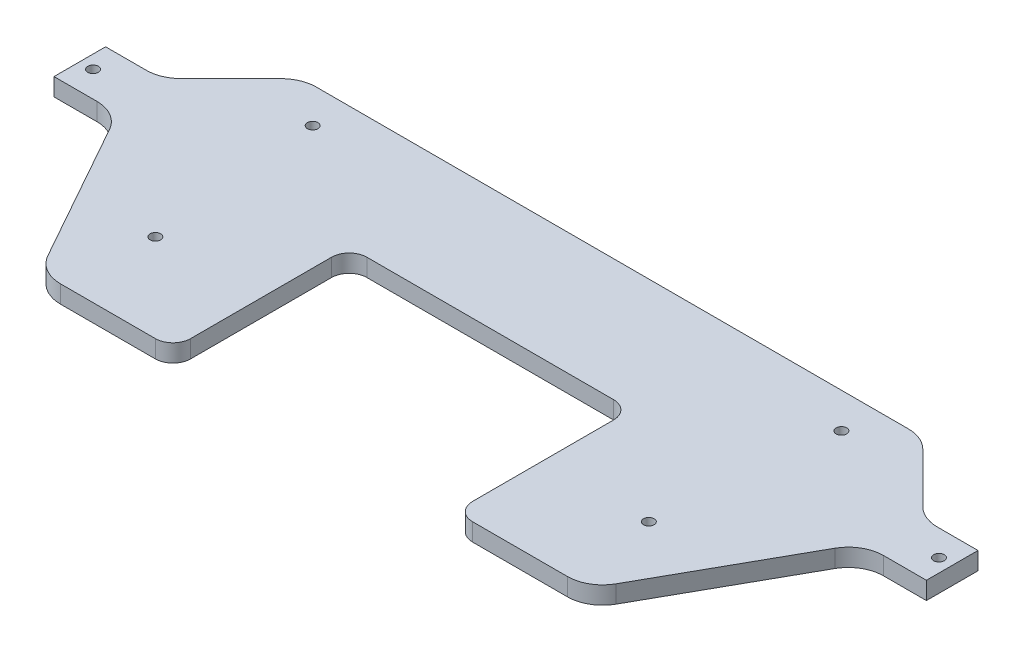
ISO-10303-21;
HEADER;
FILE_DESCRIPTION(('STEP AP214'),'2;1');
FILE_NAME('part.step','',(''),(''),'','','');
FILE_SCHEMA(('AUTOMOTIVE_DESIGN { 1 0 10303 214 1 1 1 1 }'));
ENDSEC;
DATA;
#1=APPLICATION_CONTEXT('core data for automotive mechanical design processes');
#2=APPLICATION_PROTOCOL_DEFINITION('international standard','automotive_design',2000,#1);
#3=PRODUCT_CONTEXT('',#1,'mechanical');
#4=PRODUCT('Part','Part','',(#3));
#5=PRODUCT_RELATED_PRODUCT_CATEGORY('part','',(#4));
#6=PRODUCT_DEFINITION_FORMATION('','',#4);
#7=PRODUCT_DEFINITION_CONTEXT('part definition',#1,'design');
#8=PRODUCT_DEFINITION('design','',#6,#7);
#9=PRODUCT_DEFINITION_SHAPE('','',#8);
#10=(LENGTH_UNIT() NAMED_UNIT(*) SI_UNIT(.MILLI.,.METRE.));
#11=(NAMED_UNIT(*) PLANE_ANGLE_UNIT() SI_UNIT($,.RADIAN.));
#12=(NAMED_UNIT(*) SI_UNIT($,.STERADIAN.) SOLID_ANGLE_UNIT());
#13=UNCERTAINTY_MEASURE_WITH_UNIT(LENGTH_MEASURE(1.E-05),#10,'distance_accuracy_value','');
#14=(GEOMETRIC_REPRESENTATION_CONTEXT(3) GLOBAL_UNCERTAINTY_ASSIGNED_CONTEXT((#13)) GLOBAL_UNIT_ASSIGNED_CONTEXT((#10,
#11,#12)) REPRESENTATION_CONTEXT('',''));
#15=CARTESIAN_POINT('',(0.,0.,0.));
#16=DIRECTION('',(0.,0.,1.));
#17=DIRECTION('',(1.,0.,0.));
#18=AXIS2_PLACEMENT_3D('',#15,#16,#17);
#19=CARTESIAN_POINT('',(-77.75,5.,42.3181711088205));
#20=DIRECTION('',(0.,0.,-1.));
#21=DIRECTION('',(-1.,0.,0.));
#22=AXIS2_PLACEMENT_3D('',#19,#20,#21);
#23=PLANE('',#22);
#24=DIRECTION('',(1.,0.,0.));
#25=VECTOR('',#24,1.);
#26=CARTESIAN_POINT('',(-77.75,0.,42.3181711088205));
#27=LINE('',#26,#25);
#28=CARTESIAN_POINT('',(-71.8887609744845,0.,42.3181711088205));
#29=VERTEX_POINT('',#28);
#30=CARTESIAN_POINT('',(-45.,0.,42.3181711088205));
#31=VERTEX_POINT('',#30);
#32=EDGE_CURVE('E251',#29,#31,#27,.T.);
#33=ORIENTED_EDGE('',*,*,#32,.T.);
#34=DIRECTION('',(0.,1.,0.));
#35=VECTOR('',#34,1.);
#36=CARTESIAN_POINT('',(-45.,5.,42.3181711088205));
#37=LINE('',#36,#35);
#38=CARTESIAN_POINT('',(-45.,5.,42.3181711088205));
#39=VERTEX_POINT('',#38);
#40=EDGE_CURVE('E350',#31,#39,#37,.T.);
#41=ORIENTED_EDGE('',*,*,#40,.T.);
#42=DIRECTION('',(1.,0.,0.));
#43=VECTOR('',#42,1.);
#44=CARTESIAN_POINT('',(-77.75,5.,42.3181711088205));
#45=LINE('',#44,#43);
#46=CARTESIAN_POINT('',(-71.8887609744845,5.,42.3181711088205));
#47=VERTEX_POINT('',#46);
#48=EDGE_CURVE('E458',#47,#39,#45,.T.);
#49=ORIENTED_EDGE('',*,*,#48,.F.);
#50=DIRECTION('',(0.,-1.,0.));
#51=VECTOR('',#50,1.);
#52=CARTESIAN_POINT('',(-71.8887609744845,5.,42.3181711088205));
#53=LINE('',#52,#51);
#54=EDGE_CURVE('E307',#47,#29,#53,.T.);
#55=ORIENTED_EDGE('',*,*,#54,.T.);
#56=EDGE_LOOP('',(#33,#41,#49,#55));
#57=FACE_BOUND('',#56,.T.);
#58=ADVANCED_FACE('F39',(#57),#23,.F.);
#59=CARTESIAN_POINT('',(-88.1,5.,-42.3181711088205));
#60=DIRECTION('',(0.707106781186548,0.,0.707106781186548));
#61=DIRECTION('',(0.707106781186548,0.,-0.707106781186548));
#62=AXIS2_PLACEMENT_3D('',#59,#60,#61);
#63=PLANE('',#62);
#64=DIRECTION('',(-0.707106781186548,0.,0.707106781186548));
#65=VECTOR('',#64,1.);
#66=CARTESIAN_POINT('',(-88.1,5.,-42.3181711088205));
#67=LINE('',#66,#65);
#68=CARTESIAN_POINT('',(-91.0289321881345,5.,-39.389238920686));
#69=VERTEX_POINT('',#68);
#70=CARTESIAN_POINT('',(-105.171067811865,5.,-25.247103296955));
#71=VERTEX_POINT('',#70);
#72=EDGE_CURVE('E269',#69,#71,#67,.T.);
#73=ORIENTED_EDGE('',*,*,#72,.F.);
#74=DIRECTION('',(0.,-1.,0.));
#75=VECTOR('',#74,1.);
#76=CARTESIAN_POINT('',(-91.0289321881345,5.,-39.389238920686));
#77=LINE('',#76,#75);
#78=CARTESIAN_POINT('',(-91.0289321881345,0.,-39.389238920686));
#79=VERTEX_POINT('',#78);
#80=EDGE_CURVE('E301',#69,#79,#77,.T.);
#81=ORIENTED_EDGE('',*,*,#80,.T.);
#82=DIRECTION('',(-0.707106781186548,0.,0.707106781186548));
#83=VECTOR('',#82,1.);
#84=CARTESIAN_POINT('',(-88.1,0.,-42.3181711088205));
#85=LINE('',#84,#83);
#86=CARTESIAN_POINT('',(-105.171067811865,0.,-25.247103296955));
#87=VERTEX_POINT('',#86);
#88=EDGE_CURVE('E248',#79,#87,#85,.T.);
#89=ORIENTED_EDGE('',*,*,#88,.T.);
#90=DIRECTION('',(0.,-1.,0.));
#91=VECTOR('',#90,1.);
#92=CARTESIAN_POINT('',(-105.171067811865,5.,-25.247103296955));
#93=LINE('',#92,#91);
#94=EDGE_CURVE('E299',#87,#71,#93,.F.);
#95=ORIENTED_EDGE('',*,*,#94,.T.);
#96=EDGE_LOOP('',(#73,#81,#89,#95));
#97=FACE_BOUND('',#96,.T.);
#98=ADVANCED_FACE('F477',(#97),#63,.F.);
#99=CARTESIAN_POINT('',(-108.1,5.,-22.3181711088205));
#100=DIRECTION('',(0.,0.,1.));
#101=DIRECTION('',(1.,0.,0.));
#102=AXIS2_PLACEMENT_3D('',#99,#100,#101);
#103=PLANE('',#102);
#104=DIRECTION('',(-1.,0.,0.));
#105=VECTOR('',#104,1.);
#106=CARTESIAN_POINT('',(-108.1,0.,-22.3181711088205));
#107=LINE('',#106,#105);
#108=CARTESIAN_POINT('',(-112.242135623731,0.,-22.3181711088205));
#109=VERTEX_POINT('',#108);
#110=CARTESIAN_POINT('',(-123.75,0.,-22.3181711088205));
#111=VERTEX_POINT('',#110);
#112=EDGE_CURVE('E244',#109,#111,#107,.T.);
#113=ORIENTED_EDGE('',*,*,#112,.T.);
#114=DIRECTION('',(0.,1.,0.));
#115=VECTOR('',#114,1.);
#116=CARTESIAN_POINT('',(-123.75,0.,-22.3181711088205));
#117=LINE('',#116,#115);
#118=CARTESIAN_POINT('',(-123.75,5.,-22.3181711088205));
#119=VERTEX_POINT('',#118);
#120=EDGE_CURVE('E65',#111,#119,#117,.T.);
#121=ORIENTED_EDGE('',*,*,#120,.T.);
#122=DIRECTION('',(-1.,0.,0.));
#123=VECTOR('',#122,1.);
#124=CARTESIAN_POINT('',(-108.1,5.,-22.3181711088205));
#125=LINE('',#124,#123);
#126=CARTESIAN_POINT('',(-112.242135623731,5.,-22.3181711088205));
#127=VERTEX_POINT('',#126);
#128=EDGE_CURVE('E452',#127,#119,#125,.T.);
#129=ORIENTED_EDGE('',*,*,#128,.F.);
#130=DIRECTION('',(0.,-1.,0.));
#131=VECTOR('',#130,1.);
#132=CARTESIAN_POINT('',(-112.242135623731,0.,-22.3181711088205));
#133=LINE('',#132,#131);
#134=EDGE_CURVE('E327',#127,#109,#133,.T.);
#135=ORIENTED_EDGE('',*,*,#134,.T.);
#136=EDGE_LOOP('',(#113,#121,#129,#135));
#137=FACE_BOUND('',#136,.T.);
#138=ADVANCED_FACE('F488',(#137),#103,.F.);
#139=CARTESIAN_POINT('',(-127.75,5.,-7.6818288911795));
#140=DIRECTION('',(0.,0.,-1.));
#141=DIRECTION('',(-1.,0.,0.));
#142=AXIS2_PLACEMENT_3D('',#139,#140,#141);
#143=PLANE('',#142);
#144=DIRECTION('',(1.,0.,0.));
#145=VECTOR('',#144,1.);
#146=CARTESIAN_POINT('',(-127.75,5.,-7.6818288911795));
#147=LINE('',#146,#145);
#148=CARTESIAN_POINT('',(-123.75,5.,-7.6818288911795));
#149=VERTEX_POINT('',#148);
#150=CARTESIAN_POINT('',(-111.611239025516,5.,-7.6818288911795));
#151=VERTEX_POINT('',#150);
#152=EDGE_CURVE('E240',#149,#151,#147,.T.);
#153=ORIENTED_EDGE('',*,*,#152,.F.);
#154=DIRECTION('',(0.,1.,0.));
#155=VECTOR('',#154,1.);
#156=CARTESIAN_POINT('',(-123.75,0.,-7.6818288911795));
#157=LINE('',#156,#155);
#158=CARTESIAN_POINT('',(-123.75,0.,-7.6818288911795));
#159=VERTEX_POINT('',#158);
#160=EDGE_CURVE('E224',#159,#149,#157,.T.);
#161=ORIENTED_EDGE('',*,*,#160,.F.);
#162=DIRECTION('',(1.,0.,0.));
#163=VECTOR('',#162,1.);
#164=CARTESIAN_POINT('',(-127.75,0.,-7.6818288911795));
#165=LINE('',#164,#163);
#166=CARTESIAN_POINT('',(-111.611239025516,0.,-7.6818288911795));
#167=VERTEX_POINT('',#166);
#168=EDGE_CURVE('E235',#159,#167,#165,.T.);
#169=ORIENTED_EDGE('',*,*,#168,.T.);
#170=DIRECTION('',(0.,-1.,0.));
#171=VECTOR('',#170,1.);
#172=CARTESIAN_POINT('',(-111.611239025516,5.,-7.6818288911795));
#173=LINE('',#172,#171);
#174=EDGE_CURVE('E326',#167,#151,#173,.F.);
#175=ORIENTED_EDGE('',*,*,#174,.T.);
#176=EDGE_LOOP('',(#153,#161,#169,#175));
#177=FACE_BOUND('',#176,.T.);
#178=ADVANCED_FACE('F234',(#177),#143,.F.);
#179=CARTESIAN_POINT('',(-105.75,5.,-7.6818288911795));
#180=DIRECTION('',(0.87250601594972,0.,-0.488603368931844));
#181=DIRECTION('',(-0.488603368931844,0.,-0.87250601594972));
#182=AXIS2_PLACEMENT_3D('',#179,#180,#181);
#183=PLANE('',#182);
#184=DIRECTION('',(0.488603368931844,0.,0.87250601594972));
#185=VECTOR('',#184,1.);
#186=CARTESIAN_POINT('',(-105.75,0.,-7.6818288911795));
#187=LINE('',#186,#185);
#188=CARTESIAN_POINT('',(-102.886178866018,0.,-2.56786258049794));
#189=VERTEX_POINT('',#188);
#190=CARTESIAN_POINT('',(-80.6138211339817,0.,37.2042047981389));
#191=VERTEX_POINT('',#190);
#192=EDGE_CURVE('E243',#189,#191,#187,.T.);
#193=ORIENTED_EDGE('',*,*,#192,.T.);
#194=DIRECTION('',(0.,-1.,0.));
#195=VECTOR('',#194,1.);
#196=CARTESIAN_POINT('',(-80.6138211339817,5.,37.2042047981389));
#197=LINE('',#196,#195);
#198=CARTESIAN_POINT('',(-80.6138211339817,5.,37.2042047981389));
#199=VERTEX_POINT('',#198);
#200=EDGE_CURVE('E311',#191,#199,#197,.F.);
#201=ORIENTED_EDGE('',*,*,#200,.T.);
#202=DIRECTION('',(0.488603368931844,0.,0.87250601594972));
#203=VECTOR('',#202,1.);
#204=CARTESIAN_POINT('',(-105.75,5.,-7.6818288911795));
#205=LINE('',#204,#203);
#206=CARTESIAN_POINT('',(-102.886178866018,5.,-2.56786258049794));
#207=VERTEX_POINT('',#206);
#208=EDGE_CURVE('E457',#207,#199,#205,.T.);
#209=ORIENTED_EDGE('',*,*,#208,.F.);
#210=DIRECTION('',(0.,-1.,0.));
#211=VECTOR('',#210,1.);
#212=CARTESIAN_POINT('',(-102.886178866018,0.,-2.56786258049794));
#213=LINE('',#212,#211);
#214=EDGE_CURVE('E309',#207,#189,#213,.T.);
#215=ORIENTED_EDGE('',*,*,#214,.T.);
#216=EDGE_LOOP('',(#193,#201,#209,#215));
#217=FACE_BOUND('',#216,.T.);
#218=ADVANCED_FACE('F585',(#217),#183,.F.);
#219=CARTESIAN_POINT('',(45.,5.,42.3181711088205));
#220=VERTEX_POINT('',#219);
#221=CARTESIAN_POINT('',(71.8887609744845,5.,42.3181711088205));
#222=VERTEX_POINT('',#221);
#223=EDGE_CURVE('E459',#220,#222,#45,.T.);
#224=ORIENTED_EDGE('',*,*,#223,.F.);
#225=DIRECTION('',(0.,1.,0.));
#226=VECTOR('',#225,1.);
#227=CARTESIAN_POINT('',(45.,5.,42.3181711088205));
#228=LINE('',#227,#226);
#229=CARTESIAN_POINT('',(45.,0.,42.3181711088205));
#230=VERTEX_POINT('',#229);
#231=EDGE_CURVE('E366',#220,#230,#228,.F.);
#232=ORIENTED_EDGE('',*,*,#231,.T.);
#233=CARTESIAN_POINT('',(71.8887609744845,0.,42.3181711088205));
#234=VERTEX_POINT('',#233);
#235=EDGE_CURVE('E247',#230,#234,#27,.T.);
#236=ORIENTED_EDGE('',*,*,#235,.T.);
#237=DIRECTION('',(0.,-1.,0.));
#238=VECTOR('',#237,1.);
#239=CARTESIAN_POINT('',(71.8887609744845,5.,42.3181711088205));
#240=LINE('',#239,#238);
#241=EDGE_CURVE('E303',#234,#222,#240,.F.);
#242=ORIENTED_EDGE('',*,*,#241,.T.);
#243=EDGE_LOOP('',(#224,#232,#236,#242));
#244=FACE_BOUND('',#243,.T.);
#245=ADVANCED_FACE('F513',(#244),#23,.F.);
#246=CARTESIAN_POINT('',(105.75,5.,-7.6818288911795));
#247=DIRECTION('',(-0.87250601594972,0.,-0.488603368931844));
#248=DIRECTION('',(-0.488603368931844,0.,0.87250601594972));
#249=AXIS2_PLACEMENT_3D('',#246,#247,#248);
#250=PLANE('',#249);
#251=DIRECTION('',(0.488603368931844,0.,-0.87250601594972));
#252=VECTOR('',#251,1.);
#253=CARTESIAN_POINT('',(105.75,5.,-7.6818288911795));
#254=LINE('',#253,#252);
#255=CARTESIAN_POINT('',(80.6138211339817,5.,37.2042047981389));
#256=VERTEX_POINT('',#255);
#257=CARTESIAN_POINT('',(102.886178866018,5.,-2.56786258049794));
#258=VERTEX_POINT('',#257);
#259=EDGE_CURVE('E463',#256,#258,#254,.T.);
#260=ORIENTED_EDGE('',*,*,#259,.F.);
#261=DIRECTION('',(0.,-1.,0.));
#262=VECTOR('',#261,1.);
#263=CARTESIAN_POINT('',(80.6138211339817,5.,37.2042047981389));
#264=LINE('',#263,#262);
#265=CARTESIAN_POINT('',(80.6138211339817,0.,37.2042047981389));
#266=VERTEX_POINT('',#265);
#267=EDGE_CURVE('E320',#256,#266,#264,.T.);
#268=ORIENTED_EDGE('',*,*,#267,.T.);
#269=DIRECTION('',(0.488603368931844,0.,-0.87250601594972));
#270=VECTOR('',#269,1.);
#271=CARTESIAN_POINT('',(105.75,0.,-7.6818288911795));
#272=LINE('',#271,#270);
#273=CARTESIAN_POINT('',(102.886178866018,0.,-2.56786258049794));
#274=VERTEX_POINT('',#273);
#275=EDGE_CURVE('E258',#266,#274,#272,.T.);
#276=ORIENTED_EDGE('',*,*,#275,.T.);
#277=DIRECTION('',(0.,-1.,0.));
#278=VECTOR('',#277,1.);
#279=CARTESIAN_POINT('',(102.886178866018,5.,-2.56786258049794));
#280=LINE('',#279,#278);
#281=EDGE_CURVE('E312',#274,#258,#280,.F.);
#282=ORIENTED_EDGE('',*,*,#281,.T.);
#283=EDGE_LOOP('',(#260,#268,#276,#282));
#284=FACE_BOUND('',#283,.T.);
#285=ADVANCED_FACE('F523',(#284),#250,.F.);
#286=CARTESIAN_POINT('',(127.75,5.,-7.6818288911795));
#287=DIRECTION('',(0.,0.,-1.));
#288=DIRECTION('',(-1.,0.,0.));
#289=AXIS2_PLACEMENT_3D('',#286,#287,#288);
#290=PLANE('',#289);
#291=DIRECTION('',(1.,0.,0.));
#292=VECTOR('',#291,1.);
#293=CARTESIAN_POINT('',(127.75,0.,-7.6818288911795));
#294=LINE('',#293,#292);
#295=CARTESIAN_POINT('',(111.611239025516,0.,-7.6818288911795));
#296=VERTEX_POINT('',#295);
#297=CARTESIAN_POINT('',(123.75,0.,-7.6818288911795));
#298=VERTEX_POINT('',#297);
#299=EDGE_CURVE('E259',#296,#298,#294,.T.);
#300=ORIENTED_EDGE('',*,*,#299,.T.);
#301=DIRECTION('',(0.,1.,0.));
#302=VECTOR('',#301,1.);
#303=CARTESIAN_POINT('',(123.75,0.,-7.6818288911795));
#304=LINE('',#303,#302);
#305=CARTESIAN_POINT('',(123.75,5.,-7.6818288911795));
#306=VERTEX_POINT('',#305);
#307=EDGE_CURVE('E53',#298,#306,#304,.T.);
#308=ORIENTED_EDGE('',*,*,#307,.T.);
#309=DIRECTION('',(1.,0.,0.));
#310=VECTOR('',#309,1.);
#311=CARTESIAN_POINT('',(127.75,5.,-7.6818288911795));
#312=LINE('',#311,#310);
#313=CARTESIAN_POINT('',(111.611239025516,5.,-7.6818288911795));
#314=VERTEX_POINT('',#313);
#315=EDGE_CURVE('E466',#314,#306,#312,.T.);
#316=ORIENTED_EDGE('',*,*,#315,.F.);
#317=DIRECTION('',(0.,-1.,0.));
#318=VECTOR('',#317,1.);
#319=CARTESIAN_POINT('',(111.611239025516,0.,-7.6818288911795));
#320=LINE('',#319,#318);
#321=EDGE_CURVE('E323',#314,#296,#320,.T.);
#322=ORIENTED_EDGE('',*,*,#321,.T.);
#323=EDGE_LOOP('',(#300,#308,#316,#322));
#324=FACE_BOUND('',#323,.T.);
#325=ADVANCED_FACE('F531',(#324),#290,.F.);
#326=CARTESIAN_POINT('',(108.1,5.,-22.3181711088205));
#327=DIRECTION('',(0.,0.,1.));
#328=DIRECTION('',(1.,0.,0.));
#329=AXIS2_PLACEMENT_3D('',#326,#327,#328);
#330=PLANE('',#329);
#331=DIRECTION('',(-1.,0.,0.));
#332=VECTOR('',#331,1.);
#333=CARTESIAN_POINT('',(108.1,5.,-22.3181711088205));
#334=LINE('',#333,#332);
#335=CARTESIAN_POINT('',(123.75,5.,-22.3181711088205));
#336=VERTEX_POINT('',#335);
#337=CARTESIAN_POINT('',(112.242135623731,5.,-22.3181711088205));
#338=VERTEX_POINT('',#337);
#339=EDGE_CURVE('E468',#336,#338,#334,.T.);
#340=ORIENTED_EDGE('',*,*,#339,.F.);
#341=DIRECTION('',(0.,1.,0.));
#342=VECTOR('',#341,1.);
#343=CARTESIAN_POINT('',(123.75,0.,-22.3181711088205));
#344=LINE('',#343,#342);
#345=CARTESIAN_POINT('',(123.75,0.,-22.3181711088205));
#346=VERTEX_POINT('',#345);
#347=EDGE_CURVE('E495',#346,#336,#344,.T.);
#348=ORIENTED_EDGE('',*,*,#347,.F.);
#349=DIRECTION('',(-1.,0.,0.));
#350=VECTOR('',#349,1.);
#351=CARTESIAN_POINT('',(108.1,0.,-22.3181711088205));
#352=LINE('',#351,#350);
#353=CARTESIAN_POINT('',(112.242135623731,0.,-22.3181711088205));
#354=VERTEX_POINT('',#353);
#355=EDGE_CURVE('E265',#346,#354,#352,.T.);
#356=ORIENTED_EDGE('',*,*,#355,.T.);
#357=DIRECTION('',(0.,-1.,0.));
#358=VECTOR('',#357,1.);
#359=CARTESIAN_POINT('',(112.242135623731,5.,-22.3181711088205));
#360=LINE('',#359,#358);
#361=EDGE_CURVE('E319',#354,#338,#360,.F.);
#362=ORIENTED_EDGE('',*,*,#361,.T.);
#363=EDGE_LOOP('',(#340,#348,#356,#362));
#364=FACE_BOUND('',#363,.T.);
#365=ADVANCED_FACE('F539',(#364),#330,.F.);
#366=CARTESIAN_POINT('',(88.1,5.,-42.3181711088205));
#367=DIRECTION('',(-0.707106781186548,0.,0.707106781186548));
#368=DIRECTION('',(0.707106781186548,0.,0.707106781186548));
#369=AXIS2_PLACEMENT_3D('',#366,#367,#368);
#370=PLANE('',#369);
#371=DIRECTION('',(-0.707106781186548,0.,-0.707106781186548));
#372=VECTOR('',#371,1.);
#373=CARTESIAN_POINT('',(88.1,0.,-42.3181711088205));
#374=LINE('',#373,#372);
#375=CARTESIAN_POINT('',(105.171067811865,0.,-25.247103296955));
#376=VERTEX_POINT('',#375);
#377=CARTESIAN_POINT('',(91.0289321881345,0.,-39.389238920686));
#378=VERTEX_POINT('',#377);
#379=EDGE_CURVE('E262',#376,#378,#374,.T.);
#380=ORIENTED_EDGE('',*,*,#379,.T.);
#381=DIRECTION('',(0.,-1.,0.));
#382=VECTOR('',#381,1.);
#383=CARTESIAN_POINT('',(91.0289321881345,5.,-39.389238920686));
#384=LINE('',#383,#382);
#385=CARTESIAN_POINT('',(91.0289321881345,5.,-39.389238920686));
#386=VERTEX_POINT('',#385);
#387=EDGE_CURVE('E288',#378,#386,#384,.F.);
#388=ORIENTED_EDGE('',*,*,#387,.T.);
#389=DIRECTION('',(-0.707106781186548,0.,-0.707106781186548));
#390=VECTOR('',#389,1.);
#391=CARTESIAN_POINT('',(88.1,5.,-42.3181711088205));
#392=LINE('',#391,#390);
#393=CARTESIAN_POINT('',(105.171067811865,5.,-25.247103296955));
#394=VERTEX_POINT('',#393);
#395=EDGE_CURVE('E473',#394,#386,#392,.T.);
#396=ORIENTED_EDGE('',*,*,#395,.F.);
#397=DIRECTION('',(0.,-1.,0.));
#398=VECTOR('',#397,1.);
#399=CARTESIAN_POINT('',(105.171067811865,0.,-25.247103296955));
#400=LINE('',#399,#398);
#401=EDGE_CURVE('E286',#394,#376,#400,.T.);
#402=ORIENTED_EDGE('',*,*,#401,.T.);
#403=EDGE_LOOP('',(#380,#388,#396,#402));
#404=FACE_BOUND('',#403,.T.);
#405=ADVANCED_FACE('F547',(#404),#370,.F.);
#406=CARTESIAN_POINT('',(-88.1,5.,-42.3181711088205));
#407=DIRECTION('',(0.,0.,1.));
#408=DIRECTION('',(1.,0.,0.));
#409=AXIS2_PLACEMENT_3D('',#406,#407,#408);
#410=PLANE('',#409);
#411=DIRECTION('',(-1.,0.,0.));
#412=VECTOR('',#411,1.);
#413=CARTESIAN_POINT('',(-88.1,5.,-42.3181711088205));
#414=LINE('',#413,#412);
#415=CARTESIAN_POINT('',(83.9578643762691,5.,-42.3181711088205));
#416=VERTEX_POINT('',#415);
#417=CARTESIAN_POINT('',(-83.957864376269,5.,-42.3181711088205));
#418=VERTEX_POINT('',#417);
#419=EDGE_CURVE('E273',#416,#418,#414,.T.);
#420=ORIENTED_EDGE('',*,*,#419,.F.);
#421=DIRECTION('',(0.,-1.,0.));
#422=VECTOR('',#421,1.);
#423=CARTESIAN_POINT('',(83.9578643762691,5.,-42.3181711088205));
#424=LINE('',#423,#422);
#425=CARTESIAN_POINT('',(83.9578643762691,0.,-42.3181711088205));
#426=VERTEX_POINT('',#425);
#427=EDGE_CURVE('E272',#416,#426,#424,.T.);
#428=ORIENTED_EDGE('',*,*,#427,.T.);
#429=DIRECTION('',(-1.,0.,0.));
#430=VECTOR('',#429,1.);
#431=CARTESIAN_POINT('',(-88.1,0.,-42.3181711088205));
#432=LINE('',#431,#430);
#433=CARTESIAN_POINT('',(-83.957864376269,0.,-42.3181711088205));
#434=VERTEX_POINT('',#433);
#435=EDGE_CURVE('E270',#426,#434,#432,.T.);
#436=ORIENTED_EDGE('',*,*,#435,.T.);
#437=DIRECTION('',(0.,-1.,0.));
#438=VECTOR('',#437,1.);
#439=CARTESIAN_POINT('',(-83.957864376269,5.,-42.3181711088205));
#440=LINE('',#439,#438);
#441=EDGE_CURVE('E271',#434,#418,#440,.F.);
#442=ORIENTED_EDGE('',*,*,#441,.T.);
#443=EDGE_LOOP('',(#420,#428,#436,#442));
#444=FACE_BOUND('',#443,.T.);
#445=ADVANCED_FACE('F559',(#444),#410,.F.);
#446=CARTESIAN_POINT('',(0.,5.,0.));
#447=DIRECTION('',(0.,1.,0.));
#448=DIRECTION('',(0.,0.,1.));
#449=AXIS2_PLACEMENT_3D('',#446,#447,#448);
#450=PLANE('',#449);
#451=DIRECTION('',(0.,0.,-1.));
#452=VECTOR('',#451,1.);
#453=CARTESIAN_POINT('',(-123.75,5.,-7.6818288911795));
#454=LINE('',#453,#452);
#455=EDGE_CURVE('E229',#149,#119,#454,.T.);
#456=ORIENTED_EDGE('',*,*,#455,.F.);
#457=ORIENTED_EDGE('',*,*,#152,.T.);
#458=CARTESIAN_POINT('',(-111.611239025516,5.,2.3181711088205));
#459=DIRECTION('',(0.,1.,0.));
#460=DIRECTION('',(0.,0.,1.));
#461=AXIS2_PLACEMENT_3D('',#458,#459,#460);
#462=CIRCLE('',#461,10.);
#463=EDGE_CURVE('E341',#151,#207,#462,.F.);
#464=ORIENTED_EDGE('',*,*,#463,.T.);
#465=ORIENTED_EDGE('',*,*,#208,.T.);
#466=CARTESIAN_POINT('',(-71.8887609744845,5.,32.3181711088205));
#467=DIRECTION('',(0.,1.,0.));
#468=DIRECTION('',(0.,0.,1.));
#469=AXIS2_PLACEMENT_3D('',#466,#467,#468);
#470=CIRCLE('',#469,10.);
#471=EDGE_CURVE('E291',#199,#47,#470,.T.);
#472=ORIENTED_EDGE('',*,*,#471,.T.);
#473=ORIENTED_EDGE('',*,*,#48,.T.);
#474=CARTESIAN_POINT('',(-45.,5.,37.3181711088205));
#475=DIRECTION('',(0.,1.,0.));
#476=DIRECTION('',(0.,0.,1.));
#477=AXIS2_PLACEMENT_3D('',#474,#475,#476);
#478=CIRCLE('',#477,5.);
#479=CARTESIAN_POINT('',(-40.,5.,37.3181711088205));
#480=VERTEX_POINT('',#479);
#481=EDGE_CURVE('E355',#39,#480,#478,.T.);
#482=ORIENTED_EDGE('',*,*,#481,.T.);
#483=DIRECTION('',(0.,0.,1.));
#484=VECTOR('',#483,1.);
#485=CARTESIAN_POINT('',(-40.,5.,42.3181711088205));
#486=LINE('',#485,#484);
#487=CARTESIAN_POINT('',(-40.,5.,-2.68182889117949));
#488=VERTEX_POINT('',#487);
#489=EDGE_CURVE('E387',#488,#480,#486,.T.);
#490=ORIENTED_EDGE('',*,*,#489,.F.);
#491=CARTESIAN_POINT('',(-35.,5.,-2.68182889117949));
#492=DIRECTION('',(0.,1.,0.));
#493=DIRECTION('',(0.,0.,1.));
#494=AXIS2_PLACEMENT_3D('',#491,#492,#493);
#495=CIRCLE('',#494,5.);
#496=CARTESIAN_POINT('',(-35.,5.,-7.68182889117949));
#497=VERTEX_POINT('',#496);
#498=EDGE_CURVE('E50',#488,#497,#495,.F.);
#499=ORIENTED_EDGE('',*,*,#498,.T.);
#500=DIRECTION('',(-1.,0.,0.));
#501=VECTOR('',#500,1.);
#502=CARTESIAN_POINT('',(-40.,5.,-7.68182889117949));
#503=LINE('',#502,#501);
#504=CARTESIAN_POINT('',(35.,5.,-7.68182889117949));
#505=VERTEX_POINT('',#504);
#506=EDGE_CURVE('E383',#505,#497,#503,.T.);
#507=ORIENTED_EDGE('',*,*,#506,.F.);
#508=CARTESIAN_POINT('',(35.,5.,-2.68182889117949));
#509=DIRECTION('',(0.,1.,0.));
#510=DIRECTION('',(0.,0.,1.));
#511=AXIS2_PLACEMENT_3D('',#508,#509,#510);
#512=CIRCLE('',#511,5.);
#513=CARTESIAN_POINT('',(40.,5.,-2.68182889117949));
#514=VERTEX_POINT('',#513);
#515=EDGE_CURVE('E374',#505,#514,#512,.F.);
#516=ORIENTED_EDGE('',*,*,#515,.T.);
#517=DIRECTION('',(0.,0.,-1.));
#518=VECTOR('',#517,1.);
#519=CARTESIAN_POINT('',(40.,5.,-7.68182889117949));
#520=LINE('',#519,#518);
#521=CARTESIAN_POINT('',(40.,5.,37.3181711088205));
#522=VERTEX_POINT('',#521);
#523=EDGE_CURVE('E391',#522,#514,#520,.T.);
#524=ORIENTED_EDGE('',*,*,#523,.F.);
#525=CARTESIAN_POINT('',(45.,5.,37.3181711088205));
#526=DIRECTION('',(0.,1.,0.));
#527=DIRECTION('',(0.,0.,1.));
#528=AXIS2_PLACEMENT_3D('',#525,#526,#527);
#529=CIRCLE('',#528,5.);
#530=EDGE_CURVE('E348',#522,#220,#529,.T.);
#531=ORIENTED_EDGE('',*,*,#530,.T.);
#532=ORIENTED_EDGE('',*,*,#223,.T.);
#533=CARTESIAN_POINT('',(71.8887609744845,5.,32.3181711088205));
#534=DIRECTION('',(0.,1.,0.));
#535=DIRECTION('',(0.,0.,1.));
#536=AXIS2_PLACEMENT_3D('',#533,#534,#535);
#537=CIRCLE('',#536,10.);
#538=EDGE_CURVE('E292',#222,#256,#537,.T.);
#539=ORIENTED_EDGE('',*,*,#538,.T.);
#540=ORIENTED_EDGE('',*,*,#259,.T.);
#541=CARTESIAN_POINT('',(111.611239025516,5.,2.3181711088205));
#542=DIRECTION('',(0.,1.,0.));
#543=DIRECTION('',(0.,0.,1.));
#544=AXIS2_PLACEMENT_3D('',#541,#542,#543);
#545=CIRCLE('',#544,10.);
#546=EDGE_CURVE('E338',#258,#314,#545,.F.);
#547=ORIENTED_EDGE('',*,*,#546,.T.);
#548=ORIENTED_EDGE('',*,*,#315,.T.);
#549=DIRECTION('',(0.,0.,1.));
#550=VECTOR('',#549,1.);
#551=CARTESIAN_POINT('',(123.75,5.,-7.6818288911795));
#552=LINE('',#551,#550);
#553=EDGE_CURVE('E497',#336,#306,#552,.T.);
#554=ORIENTED_EDGE('',*,*,#553,.F.);
#555=ORIENTED_EDGE('',*,*,#339,.T.);
#556=CARTESIAN_POINT('',(112.242135623731,5.,-32.3181711088205));
#557=DIRECTION('',(0.,1.,0.));
#558=DIRECTION('',(0.,0.,1.));
#559=AXIS2_PLACEMENT_3D('',#556,#557,#558);
#560=CIRCLE('',#559,10.);
#561=EDGE_CURVE('E331',#338,#394,#560,.F.);
#562=ORIENTED_EDGE('',*,*,#561,.T.);
#563=ORIENTED_EDGE('',*,*,#395,.T.);
#564=CARTESIAN_POINT('',(83.9578643762691,5.,-32.3181711088205));
#565=DIRECTION('',(0.,1.,0.));
#566=DIRECTION('',(0.,0.,1.));
#567=AXIS2_PLACEMENT_3D('',#564,#565,#566);
#568=CIRCLE('',#567,10.);
#569=EDGE_CURVE('E300',#386,#416,#568,.T.);
#570=ORIENTED_EDGE('',*,*,#569,.T.);
#571=ORIENTED_EDGE('',*,*,#419,.T.);
#572=CARTESIAN_POINT('',(-83.957864376269,5.,-32.3181711088205));
#573=DIRECTION('',(0.,1.,0.));
#574=DIRECTION('',(0.,0.,1.));
#575=AXIS2_PLACEMENT_3D('',#572,#573,#574);
#576=CIRCLE('',#575,10.);
#577=EDGE_CURVE('E293',#418,#69,#576,.T.);
#578=ORIENTED_EDGE('',*,*,#577,.T.);
#579=ORIENTED_EDGE('',*,*,#72,.T.);
#580=CARTESIAN_POINT('',(-112.242135623731,5.,-32.3181711088205));
#581=DIRECTION('',(0.,1.,0.));
#582=DIRECTION('',(0.,0.,1.));
#583=AXIS2_PLACEMENT_3D('',#580,#581,#582);
#584=CIRCLE('',#583,10.);
#585=EDGE_CURVE('E345',#71,#127,#584,.F.);
#586=ORIENTED_EDGE('',*,*,#585,.T.);
#587=ORIENTED_EDGE('',*,*,#128,.T.);
#588=EDGE_LOOP('',(#456,#457,#464,#465,#472,#473,#482,#490,#499,#507,#516,#524,#531,#532,#539,
#540,#547,#548,#554,#555,#562,#563,#570,#571,#578,#579,#586,#587));
#589=FACE_BOUND('',#588,.T.);
#590=CARTESIAN_POINT('',(75.,5.,-32.3181711088205));
#591=DIRECTION('',(0.,1.,0.));
#592=DIRECTION('',(0.,0.,1.));
#593=AXIS2_PLACEMENT_3D('',#590,#591,#592);
#594=CIRCLE('',#593,1.5);
#595=CARTESIAN_POINT('',(75.,5.,-30.8181711088205));
#596=VERTEX_POINT('',#595);
#597=EDGE_CURVE('E409',#596,#596,#594,.T.);
#598=ORIENTED_EDGE('',*,*,#597,.F.);
#599=EDGE_LOOP('',(#598));
#600=FACE_BOUND('',#599,.T.);
#601=CARTESIAN_POINT('',(-70.,5.,17.3181711088205));
#602=DIRECTION('',(0.,1.,0.));
#603=DIRECTION('',(0.,0.,1.));
#604=AXIS2_PLACEMENT_3D('',#601,#602,#603);
#605=CIRCLE('',#604,1.5);
#606=CARTESIAN_POINT('',(-70.,5.,18.8181711088205));
#607=VERTEX_POINT('',#606);
#608=EDGE_CURVE('E433',#607,#607,#605,.T.);
#609=ORIENTED_EDGE('',*,*,#608,.F.);
#610=EDGE_LOOP('',(#609));
#611=FACE_BOUND('',#610,.T.);
#612=CARTESIAN_POINT('',(-119.996067811865,5.,-15.));
#613=DIRECTION('',(0.,1.,0.));
#614=DIRECTION('',(0.,0.,1.));
#615=AXIS2_PLACEMENT_3D('',#612,#613,#614);
#616=CIRCLE('',#615,1.5);
#617=CARTESIAN_POINT('',(-119.996067811865,5.,-13.5));
#618=VERTEX_POINT('',#617);
#619=EDGE_CURVE('E439',#618,#618,#616,.T.);
#620=ORIENTED_EDGE('',*,*,#619,.F.);
#621=EDGE_LOOP('',(#620));
#622=FACE_BOUND('',#621,.T.);
#623=CARTESIAN_POINT('',(119.996067811865,5.,-15.));
#624=DIRECTION('',(0.,1.,0.));
#625=DIRECTION('',(0.,0.,1.));
#626=AXIS2_PLACEMENT_3D('',#623,#624,#625);
#627=CIRCLE('',#626,1.5);
#628=CARTESIAN_POINT('',(119.996067811865,5.,-13.5));
#629=VERTEX_POINT('',#628);
#630=EDGE_CURVE('E423',#629,#629,#627,.T.);
#631=ORIENTED_EDGE('',*,*,#630,.F.);
#632=EDGE_LOOP('',(#631));
#633=FACE_BOUND('',#632,.T.);
#634=CARTESIAN_POINT('',(-75.,5.,-32.3181711088205));
#635=DIRECTION('',(0.,1.,0.));
#636=DIRECTION('',(0.,0.,1.));
#637=AXIS2_PLACEMENT_3D('',#634,#635,#636);
#638=CIRCLE('',#637,1.5);
#639=CARTESIAN_POINT('',(-75.,5.,-30.8181711088205));
#640=VERTEX_POINT('',#639);
#641=EDGE_CURVE('E428',#640,#640,#638,.T.);
#642=ORIENTED_EDGE('',*,*,#641,.F.);
#643=EDGE_LOOP('',(#642));
#644=FACE_BOUND('',#643,.T.);
#645=CARTESIAN_POINT('',(70.,5.,17.3181711088205));
#646=DIRECTION('',(0.,1.,0.));
#647=DIRECTION('',(0.,0.,1.));
#648=AXIS2_PLACEMENT_3D('',#645,#646,#647);
#649=CIRCLE('',#648,1.5);
#650=CARTESIAN_POINT('',(70.,5.,18.8181711088205));
#651=VERTEX_POINT('',#650);
#652=EDGE_CURVE('E436',#651,#651,#649,.T.);
#653=ORIENTED_EDGE('',*,*,#652,.F.);
#654=EDGE_LOOP('',(#653));
#655=FACE_BOUND('',#654,.T.);
#656=ADVANCED_FACE('F385',(#589,#600,#611,#622,#633,#644,#655),#450,.T.);
#657=CARTESIAN_POINT('',(0.,0.,0.));
#658=DIRECTION('',(0.,1.,0.));
#659=DIRECTION('',(0.,0.,1.));
#660=AXIS2_PLACEMENT_3D('',#657,#658,#659);
#661=PLANE('',#660);
#662=CARTESIAN_POINT('',(75.,0.,-32.3181711088205));
#663=DIRECTION('',(0.,1.,0.));
#664=DIRECTION('',(0.,0.,1.));
#665=AXIS2_PLACEMENT_3D('',#662,#663,#664);
#666=CIRCLE('',#665,1.5);
#667=CARTESIAN_POINT('',(75.,0.,-30.8181711088205));
#668=VERTEX_POINT('',#667);
#669=EDGE_CURVE('E407',#668,#668,#666,.T.);
#670=ORIENTED_EDGE('',*,*,#669,.T.);
#671=EDGE_LOOP('',(#670));
#672=FACE_BOUND('',#671,.T.);
#673=CARTESIAN_POINT('',(-70.,0.,17.3181711088205));
#674=DIRECTION('',(0.,1.,0.));
#675=DIRECTION('',(0.,0.,1.));
#676=AXIS2_PLACEMENT_3D('',#673,#674,#675);
#677=CIRCLE('',#676,1.5);
#678=CARTESIAN_POINT('',(-70.,0.,18.8181711088205));
#679=VERTEX_POINT('',#678);
#680=EDGE_CURVE('E440',#679,#679,#677,.T.);
#681=ORIENTED_EDGE('',*,*,#680,.T.);
#682=EDGE_LOOP('',(#681));
#683=FACE_BOUND('',#682,.T.);
#684=CARTESIAN_POINT('',(-119.996067811865,0.,-15.));
#685=DIRECTION('',(0.,1.,0.));
#686=DIRECTION('',(0.,0.,1.));
#687=AXIS2_PLACEMENT_3D('',#684,#685,#686);
#688=CIRCLE('',#687,1.5);
#689=CARTESIAN_POINT('',(-119.996067811865,0.,-13.5));
#690=VERTEX_POINT('',#689);
#691=EDGE_CURVE('E424',#690,#690,#688,.T.);
#692=ORIENTED_EDGE('',*,*,#691,.T.);
#693=EDGE_LOOP('',(#692));
#694=FACE_BOUND('',#693,.T.);
#695=CARTESIAN_POINT('',(119.996067811865,0.,-15.));
#696=DIRECTION('',(0.,1.,0.));
#697=DIRECTION('',(0.,0.,1.));
#698=AXIS2_PLACEMENT_3D('',#695,#696,#697);
#699=CIRCLE('',#698,1.5);
#700=CARTESIAN_POINT('',(119.996067811865,0.,-13.5));
#701=VERTEX_POINT('',#700);
#702=EDGE_CURVE('E422',#701,#701,#699,.T.);
#703=ORIENTED_EDGE('',*,*,#702,.T.);
#704=EDGE_LOOP('',(#703));
#705=FACE_BOUND('',#704,.T.);
#706=CARTESIAN_POINT('',(-75.,0.,-32.3181711088205));
#707=DIRECTION('',(0.,1.,0.));
#708=DIRECTION('',(0.,0.,1.));
#709=AXIS2_PLACEMENT_3D('',#706,#707,#708);
#710=CIRCLE('',#709,1.5);
#711=CARTESIAN_POINT('',(-75.,0.,-30.8181711088205));
#712=VERTEX_POINT('',#711);
#713=EDGE_CURVE('E420',#712,#712,#710,.T.);
#714=ORIENTED_EDGE('',*,*,#713,.T.);
#715=EDGE_LOOP('',(#714));
#716=FACE_BOUND('',#715,.T.);
#717=CARTESIAN_POINT('',(70.,0.,17.3181711088205));
#718=DIRECTION('',(0.,1.,0.));
#719=DIRECTION('',(0.,0.,1.));
#720=AXIS2_PLACEMENT_3D('',#717,#718,#719);
#721=CIRCLE('',#720,1.5);
#722=CARTESIAN_POINT('',(70.,0.,18.8181711088205));
#723=VERTEX_POINT('',#722);
#724=EDGE_CURVE('E443',#723,#723,#721,.T.);
#725=ORIENTED_EDGE('',*,*,#724,.T.);
#726=EDGE_LOOP('',(#725));
#727=FACE_BOUND('',#726,.T.);
#728=ORIENTED_EDGE('',*,*,#168,.F.);
#729=DIRECTION('',(0.,0.,-1.));
#730=VECTOR('',#729,1.);
#731=CARTESIAN_POINT('',(-123.75,0.,-7.6818288911795));
#732=LINE('',#731,#730);
#733=EDGE_CURVE('E219',#159,#111,#732,.T.);
#734=ORIENTED_EDGE('',*,*,#733,.T.);
#735=ORIENTED_EDGE('',*,*,#112,.F.);
#736=CARTESIAN_POINT('',(-112.242135623731,0.,-32.3181711088205));
#737=DIRECTION('',(0.,1.,0.));
#738=DIRECTION('',(0.,0.,1.));
#739=AXIS2_PLACEMENT_3D('',#736,#737,#738);
#740=CIRCLE('',#739,10.);
#741=EDGE_CURVE('E344',#109,#87,#740,.T.);
#742=ORIENTED_EDGE('',*,*,#741,.T.);
#743=ORIENTED_EDGE('',*,*,#88,.F.);
#744=CARTESIAN_POINT('',(-83.957864376269,0.,-32.3181711088205));
#745=DIRECTION('',(0.,1.,0.));
#746=DIRECTION('',(0.,0.,1.));
#747=AXIS2_PLACEMENT_3D('',#744,#745,#746);
#748=CIRCLE('',#747,10.);
#749=EDGE_CURVE('E285',#79,#434,#748,.F.);
#750=ORIENTED_EDGE('',*,*,#749,.T.);
#751=ORIENTED_EDGE('',*,*,#435,.F.);
#752=CARTESIAN_POINT('',(83.9578643762691,0.,-32.3181711088205));
#753=DIRECTION('',(0.,1.,0.));
#754=DIRECTION('',(0.,0.,1.));
#755=AXIS2_PLACEMENT_3D('',#752,#753,#754);
#756=CIRCLE('',#755,10.);
#757=EDGE_CURVE('E284',#426,#378,#756,.F.);
#758=ORIENTED_EDGE('',*,*,#757,.T.);
#759=ORIENTED_EDGE('',*,*,#379,.F.);
#760=CARTESIAN_POINT('',(112.242135623731,0.,-32.3181711088205));
#761=DIRECTION('',(0.,1.,0.));
#762=DIRECTION('',(0.,0.,1.));
#763=AXIS2_PLACEMENT_3D('',#760,#761,#762);
#764=CIRCLE('',#763,10.);
#765=EDGE_CURVE('E332',#376,#354,#764,.T.);
#766=ORIENTED_EDGE('',*,*,#765,.T.);
#767=ORIENTED_EDGE('',*,*,#355,.F.);
#768=DIRECTION('',(0.,0.,1.));
#769=VECTOR('',#768,1.);
#770=CARTESIAN_POINT('',(123.75,0.,-7.6818288911795));
#771=LINE('',#770,#769);
#772=EDGE_CURVE('E493',#346,#298,#771,.T.);
#773=ORIENTED_EDGE('',*,*,#772,.T.);
#774=ORIENTED_EDGE('',*,*,#299,.F.);
#775=CARTESIAN_POINT('',(111.611239025516,0.,2.3181711088205));
#776=DIRECTION('',(0.,1.,0.));
#777=DIRECTION('',(0.,0.,1.));
#778=AXIS2_PLACEMENT_3D('',#775,#776,#777);
#779=CIRCLE('',#778,10.);
#780=EDGE_CURVE('E337',#296,#274,#779,.T.);
#781=ORIENTED_EDGE('',*,*,#780,.T.);
#782=ORIENTED_EDGE('',*,*,#275,.F.);
#783=CARTESIAN_POINT('',(71.8887609744845,0.,32.3181711088205));
#784=DIRECTION('',(0.,1.,0.));
#785=DIRECTION('',(0.,0.,1.));
#786=AXIS2_PLACEMENT_3D('',#783,#784,#785);
#787=CIRCLE('',#786,10.);
#788=EDGE_CURVE('E280',#266,#234,#787,.F.);
#789=ORIENTED_EDGE('',*,*,#788,.T.);
#790=ORIENTED_EDGE('',*,*,#235,.F.);
#791=CARTESIAN_POINT('',(45.,0.,37.3181711088205));
#792=DIRECTION('',(0.,1.,0.));
#793=DIRECTION('',(0.,0.,1.));
#794=AXIS2_PLACEMENT_3D('',#791,#792,#793);
#795=CIRCLE('',#794,5.);
#796=CARTESIAN_POINT('',(40.,0.,37.3181711088205));
#797=VERTEX_POINT('',#796);
#798=EDGE_CURVE('E358',#230,#797,#795,.F.);
#799=ORIENTED_EDGE('',*,*,#798,.T.);
#800=DIRECTION('',(0.,0.,-1.));
#801=VECTOR('',#800,1.);
#802=CARTESIAN_POINT('',(40.,0.,-7.68182889117949));
#803=LINE('',#802,#801);
#804=CARTESIAN_POINT('',(40.,0.,-2.68182889117949));
#805=VERTEX_POINT('',#804);
#806=EDGE_CURVE('E411',#797,#805,#803,.T.);
#807=ORIENTED_EDGE('',*,*,#806,.T.);
#808=CARTESIAN_POINT('',(35.,0.,-2.68182889117949));
#809=DIRECTION('',(0.,1.,0.));
#810=DIRECTION('',(0.,0.,1.));
#811=AXIS2_PLACEMENT_3D('',#808,#809,#810);
#812=CIRCLE('',#811,5.);
#813=CARTESIAN_POINT('',(35.,0.,-7.68182889117949));
#814=VERTEX_POINT('',#813);
#815=EDGE_CURVE('E380',#805,#814,#812,.T.);
#816=ORIENTED_EDGE('',*,*,#815,.T.);
#817=DIRECTION('',(-1.,0.,0.));
#818=VECTOR('',#817,1.);
#819=CARTESIAN_POINT('',(-40.,0.,-7.68182889117949));
#820=LINE('',#819,#818);
#821=CARTESIAN_POINT('',(-35.,0.,-7.68182889117949));
#822=VERTEX_POINT('',#821);
#823=EDGE_CURVE('E405',#814,#822,#820,.T.);
#824=ORIENTED_EDGE('',*,*,#823,.T.);
#825=CARTESIAN_POINT('',(-35.,0.,-2.68182889117949));
#826=DIRECTION('',(0.,1.,0.));
#827=DIRECTION('',(0.,0.,1.));
#828=AXIS2_PLACEMENT_3D('',#825,#826,#827);
#829=CIRCLE('',#828,5.);
#830=CARTESIAN_POINT('',(-40.,0.,-2.68182889117949));
#831=VERTEX_POINT('',#830);
#832=EDGE_CURVE('E11',#822,#831,#829,.T.);
#833=ORIENTED_EDGE('',*,*,#832,.T.);
#834=DIRECTION('',(0.,0.,1.));
#835=VECTOR('',#834,1.);
#836=CARTESIAN_POINT('',(-40.,0.,42.3181711088205));
#837=LINE('',#836,#835);
#838=CARTESIAN_POINT('',(-40.,0.,37.3181711088205));
#839=VERTEX_POINT('',#838);
#840=EDGE_CURVE('E400',#831,#839,#837,.T.);
#841=ORIENTED_EDGE('',*,*,#840,.T.);
#842=CARTESIAN_POINT('',(-45.,0.,37.3181711088205));
#843=DIRECTION('',(0.,1.,0.));
#844=DIRECTION('',(0.,0.,1.));
#845=AXIS2_PLACEMENT_3D('',#842,#843,#844);
#846=CIRCLE('',#845,5.);
#847=EDGE_CURVE('E363',#839,#31,#846,.F.);
#848=ORIENTED_EDGE('',*,*,#847,.T.);
#849=ORIENTED_EDGE('',*,*,#32,.F.);
#850=CARTESIAN_POINT('',(-71.8887609744845,0.,32.3181711088205));
#851=DIRECTION('',(0.,1.,0.));
#852=DIRECTION('',(0.,0.,1.));
#853=AXIS2_PLACEMENT_3D('',#850,#851,#852);
#854=CIRCLE('',#853,10.);
#855=EDGE_CURVE('E278',#29,#191,#854,.F.);
#856=ORIENTED_EDGE('',*,*,#855,.T.);
#857=ORIENTED_EDGE('',*,*,#192,.F.);
#858=CARTESIAN_POINT('',(-111.611239025516,0.,2.3181711088205));
#859=DIRECTION('',(0.,1.,0.));
#860=DIRECTION('',(0.,0.,1.));
#861=AXIS2_PLACEMENT_3D('',#858,#859,#860);
#862=CIRCLE('',#861,10.);
#863=EDGE_CURVE('E242',#189,#167,#862,.T.);
#864=ORIENTED_EDGE('',*,*,#863,.T.);
#865=EDGE_LOOP('',(#728,#734,#735,#742,#743,#750,#751,#758,#759,#766,#767,#773,#774,#781,#782,
#789,#790,#799,#807,#816,#824,#833,#841,#848,#849,#856,#857,#864));
#866=FACE_BOUND('',#865,.T.);
#867=ADVANCED_FACE('F239',(#672,#683,#694,#705,#716,#727,#866),#661,.F.);
#868=CARTESIAN_POINT('',(83.9578643762691,5.,-32.3181711088205));
#869=DIRECTION('',(0.,-1.,0.));
#870=DIRECTION('',(0.,0.,-1.));
#871=AXIS2_PLACEMENT_3D('',#868,#869,#870);
#872=CYLINDRICAL_SURFACE('',#871,10.);
#873=ORIENTED_EDGE('',*,*,#569,.F.);
#874=ORIENTED_EDGE('',*,*,#387,.F.);
#875=ORIENTED_EDGE('',*,*,#757,.F.);
#876=ORIENTED_EDGE('',*,*,#427,.F.);
#877=EDGE_LOOP('',(#873,#874,#875,#876));
#878=FACE_BOUND('',#877,.T.);
#879=ADVANCED_FACE('F551',(#878),#872,.T.);
#880=CARTESIAN_POINT('',(-83.957864376269,5.,-32.3181711088205));
#881=DIRECTION('',(0.,-1.,0.));
#882=DIRECTION('',(0.,0.,-1.));
#883=AXIS2_PLACEMENT_3D('',#880,#881,#882);
#884=CYLINDRICAL_SURFACE('',#883,10.);
#885=ORIENTED_EDGE('',*,*,#577,.F.);
#886=ORIENTED_EDGE('',*,*,#441,.F.);
#887=ORIENTED_EDGE('',*,*,#749,.F.);
#888=ORIENTED_EDGE('',*,*,#80,.F.);
#889=EDGE_LOOP('',(#885,#886,#887,#888));
#890=FACE_BOUND('',#889,.T.);
#891=ADVANCED_FACE('F562',(#890),#884,.T.);
#892=CARTESIAN_POINT('',(-71.8887609744845,5.,32.3181711088205));
#893=DIRECTION('',(0.,-1.,0.));
#894=DIRECTION('',(0.,0.,-1.));
#895=AXIS2_PLACEMENT_3D('',#892,#893,#894);
#896=CYLINDRICAL_SURFACE('',#895,10.);
#897=ORIENTED_EDGE('',*,*,#471,.F.);
#898=ORIENTED_EDGE('',*,*,#200,.F.);
#899=ORIENTED_EDGE('',*,*,#855,.F.);
#900=ORIENTED_EDGE('',*,*,#54,.F.);
#901=EDGE_LOOP('',(#897,#898,#899,#900));
#902=FACE_BOUND('',#901,.T.);
#903=ADVANCED_FACE('F563',(#902),#896,.T.);
#904=CARTESIAN_POINT('',(71.8887609744845,5.,32.3181711088205));
#905=DIRECTION('',(0.,-1.,0.));
#906=DIRECTION('',(0.,0.,-1.));
#907=AXIS2_PLACEMENT_3D('',#904,#905,#906);
#908=CYLINDRICAL_SURFACE('',#907,10.);
#909=ORIENTED_EDGE('',*,*,#538,.F.);
#910=ORIENTED_EDGE('',*,*,#241,.F.);
#911=ORIENTED_EDGE('',*,*,#788,.F.);
#912=ORIENTED_EDGE('',*,*,#267,.F.);
#913=EDGE_LOOP('',(#909,#910,#911,#912));
#914=FACE_BOUND('',#913,.T.);
#915=ADVANCED_FACE('F516',(#914),#908,.T.);
#916=CARTESIAN_POINT('',(112.242135623731,5.,-32.3181711088205));
#917=DIRECTION('',(0.,1.,0.));
#918=DIRECTION('',(0.,0.,1.));
#919=AXIS2_PLACEMENT_3D('',#916,#917,#918);
#920=CYLINDRICAL_SURFACE('',#919,10.);
#921=ORIENTED_EDGE('',*,*,#561,.F.);
#922=ORIENTED_EDGE('',*,*,#361,.F.);
#923=ORIENTED_EDGE('',*,*,#765,.F.);
#924=ORIENTED_EDGE('',*,*,#401,.F.);
#925=EDGE_LOOP('',(#921,#922,#923,#924));
#926=FACE_BOUND('',#925,.T.);
#927=ADVANCED_FACE('F552',(#926),#920,.F.);
#928=CARTESIAN_POINT('',(111.611239025516,5.,2.3181711088205));
#929=DIRECTION('',(0.,1.,0.));
#930=DIRECTION('',(0.,0.,1.));
#931=AXIS2_PLACEMENT_3D('',#928,#929,#930);
#932=CYLINDRICAL_SURFACE('',#931,10.);
#933=ORIENTED_EDGE('',*,*,#546,.F.);
#934=ORIENTED_EDGE('',*,*,#281,.F.);
#935=ORIENTED_EDGE('',*,*,#780,.F.);
#936=ORIENTED_EDGE('',*,*,#321,.F.);
#937=EDGE_LOOP('',(#933,#934,#935,#936));
#938=FACE_BOUND('',#937,.T.);
#939=ADVANCED_FACE('F526',(#938),#932,.F.);
#940=CARTESIAN_POINT('',(-111.611239025516,5.,2.3181711088205));
#941=DIRECTION('',(0.,1.,0.));
#942=DIRECTION('',(0.,0.,1.));
#943=AXIS2_PLACEMENT_3D('',#940,#941,#942);
#944=CYLINDRICAL_SURFACE('',#943,10.);
#945=ORIENTED_EDGE('',*,*,#463,.F.);
#946=ORIENTED_EDGE('',*,*,#174,.F.);
#947=ORIENTED_EDGE('',*,*,#863,.F.);
#948=ORIENTED_EDGE('',*,*,#214,.F.);
#949=EDGE_LOOP('',(#945,#946,#947,#948));
#950=FACE_BOUND('',#949,.T.);
#951=ADVANCED_FACE('F767',(#950),#944,.F.);
#952=CARTESIAN_POINT('',(-112.242135623731,5.,-32.3181711088205));
#953=DIRECTION('',(0.,1.,0.));
#954=DIRECTION('',(0.,0.,1.));
#955=AXIS2_PLACEMENT_3D('',#952,#953,#954);
#956=CYLINDRICAL_SURFACE('',#955,10.);
#957=ORIENTED_EDGE('',*,*,#585,.F.);
#958=ORIENTED_EDGE('',*,*,#94,.F.);
#959=ORIENTED_EDGE('',*,*,#741,.F.);
#960=ORIENTED_EDGE('',*,*,#134,.F.);
#961=EDGE_LOOP('',(#957,#958,#959,#960));
#962=FACE_BOUND('',#961,.T.);
#963=ADVANCED_FACE('F482',(#962),#956,.F.);
#964=CARTESIAN_POINT('',(70.,0.,17.3181711088205));
#965=DIRECTION('',(0.,1.,0.));
#966=DIRECTION('',(0.,0.,1.));
#967=AXIS2_PLACEMENT_3D('',#964,#965,#966);
#968=CYLINDRICAL_SURFACE('',#967,1.5);
#969=ORIENTED_EDGE('',*,*,#724,.F.);
#970=EDGE_LOOP('',(#969));
#971=FACE_BOUND('',#970,.T.);
#972=ORIENTED_EDGE('',*,*,#652,.T.);
#973=EDGE_LOOP('',(#972));
#974=FACE_BOUND('',#973,.T.);
#975=ADVANCED_FACE('F753',(#971,#974),#968,.F.);
#976=CARTESIAN_POINT('',(-75.,0.,-32.3181711088205));
#977=DIRECTION('',(0.,1.,0.));
#978=DIRECTION('',(0.,0.,1.));
#979=AXIS2_PLACEMENT_3D('',#976,#977,#978);
#980=CYLINDRICAL_SURFACE('',#979,1.5);
#981=ORIENTED_EDGE('',*,*,#713,.F.);
#982=EDGE_LOOP('',(#981));
#983=FACE_BOUND('',#982,.T.);
#984=ORIENTED_EDGE('',*,*,#641,.T.);
#985=EDGE_LOOP('',(#984));
#986=FACE_BOUND('',#985,.T.);
#987=ADVANCED_FACE('F742',(#983,#986),#980,.F.);
#988=CARTESIAN_POINT('',(119.996067811865,0.,-15.));
#989=DIRECTION('',(0.,1.,0.));
#990=DIRECTION('',(0.,0.,1.));
#991=AXIS2_PLACEMENT_3D('',#988,#989,#990);
#992=CYLINDRICAL_SURFACE('',#991,1.5);
#993=ORIENTED_EDGE('',*,*,#702,.F.);
#994=EDGE_LOOP('',(#993));
#995=FACE_BOUND('',#994,.T.);
#996=ORIENTED_EDGE('',*,*,#630,.T.);
#997=EDGE_LOOP('',(#996));
#998=FACE_BOUND('',#997,.T.);
#999=ADVANCED_FACE('F731',(#995,#998),#992,.F.);
#1000=CARTESIAN_POINT('',(-119.996067811865,0.,-15.));
#1001=DIRECTION('',(0.,1.,0.));
#1002=DIRECTION('',(0.,0.,1.));
#1003=AXIS2_PLACEMENT_3D('',#1000,#1001,#1002);
#1004=CYLINDRICAL_SURFACE('',#1003,1.5);
#1005=ORIENTED_EDGE('',*,*,#691,.F.);
#1006=EDGE_LOOP('',(#1005));
#1007=FACE_BOUND('',#1006,.T.);
#1008=ORIENTED_EDGE('',*,*,#619,.T.);
#1009=EDGE_LOOP('',(#1008));
#1010=FACE_BOUND('',#1009,.T.);
#1011=ADVANCED_FACE('F724',(#1007,#1010),#1004,.F.);
#1012=CARTESIAN_POINT('',(-70.,0.,17.3181711088205));
#1013=DIRECTION('',(0.,1.,0.));
#1014=DIRECTION('',(0.,0.,1.));
#1015=AXIS2_PLACEMENT_3D('',#1012,#1013,#1014);
#1016=CYLINDRICAL_SURFACE('',#1015,1.5);
#1017=ORIENTED_EDGE('',*,*,#680,.F.);
#1018=EDGE_LOOP('',(#1017));
#1019=FACE_BOUND('',#1018,.T.);
#1020=ORIENTED_EDGE('',*,*,#608,.T.);
#1021=EDGE_LOOP('',(#1020));
#1022=FACE_BOUND('',#1021,.T.);
#1023=ADVANCED_FACE('F714',(#1019,#1022),#1016,.F.);
#1024=CARTESIAN_POINT('',(75.,0.,-32.3181711088205));
#1025=DIRECTION('',(0.,1.,0.));
#1026=DIRECTION('',(0.,0.,1.));
#1027=AXIS2_PLACEMENT_3D('',#1024,#1025,#1026);
#1028=CYLINDRICAL_SURFACE('',#1027,1.5);
#1029=ORIENTED_EDGE('',*,*,#669,.F.);
#1030=EDGE_LOOP('',(#1029));
#1031=FACE_BOUND('',#1030,.T.);
#1032=ORIENTED_EDGE('',*,*,#597,.T.);
#1033=EDGE_LOOP('',(#1032));
#1034=FACE_BOUND('',#1033,.T.);
#1035=ADVANCED_FACE('F703',(#1031,#1034),#1028,.F.);
#1036=CARTESIAN_POINT('',(-40.,0.,42.3181711088205));
#1037=DIRECTION('',(-1.,0.,0.));
#1038=DIRECTION('',(0.,0.,1.));
#1039=AXIS2_PLACEMENT_3D('',#1036,#1037,#1038);
#1040=PLANE('',#1039);
#1041=ORIENTED_EDGE('',*,*,#489,.T.);
#1042=DIRECTION('',(0.,1.,0.));
#1043=VECTOR('',#1042,1.);
#1044=CARTESIAN_POINT('',(-40.,0.,37.3181711088205));
#1045=LINE('',#1044,#1043);
#1046=EDGE_CURVE('E357',#480,#839,#1045,.F.);
#1047=ORIENTED_EDGE('',*,*,#1046,.T.);
#1048=ORIENTED_EDGE('',*,*,#840,.F.);
#1049=DIRECTION('',(0.,1.,0.));
#1050=VECTOR('',#1049,1.);
#1051=CARTESIAN_POINT('',(-40.,5.,-2.68182889117949));
#1052=LINE('',#1051,#1050);
#1053=EDGE_CURVE('E354',#831,#488,#1052,.T.);
#1054=ORIENTED_EDGE('',*,*,#1053,.T.);
#1055=EDGE_LOOP('',(#1041,#1047,#1048,#1054));
#1056=FACE_BOUND('',#1055,.T.);
#1057=ADVANCED_FACE('F404',(#1056),#1040,.F.);
#1058=CARTESIAN_POINT('',(-40.,0.,-7.68182889117949));
#1059=DIRECTION('',(0.,0.,-1.));
#1060=DIRECTION('',(-1.,0.,0.));
#1061=AXIS2_PLACEMENT_3D('',#1058,#1059,#1060);
#1062=PLANE('',#1061);
#1063=ORIENTED_EDGE('',*,*,#823,.F.);
#1064=DIRECTION('',(0.,1.,0.));
#1065=VECTOR('',#1064,1.);
#1066=CARTESIAN_POINT('',(35.,5.,-7.68182889117949));
#1067=LINE('',#1066,#1065);
#1068=EDGE_CURVE('E375',#814,#505,#1067,.T.);
#1069=ORIENTED_EDGE('',*,*,#1068,.T.);
#1070=ORIENTED_EDGE('',*,*,#506,.T.);
#1071=DIRECTION('',(0.,1.,0.));
#1072=VECTOR('',#1071,1.);
#1073=CARTESIAN_POINT('',(-35.,0.,-7.68182889117949));
#1074=LINE('',#1073,#1072);
#1075=EDGE_CURVE('E367',#497,#822,#1074,.F.);
#1076=ORIENTED_EDGE('',*,*,#1075,.T.);
#1077=EDGE_LOOP('',(#1063,#1069,#1070,#1076));
#1078=FACE_BOUND('',#1077,.T.);
#1079=ADVANCED_FACE('F395',(#1078),#1062,.F.);
#1080=CARTESIAN_POINT('',(40.,0.,-7.68182889117949));
#1081=DIRECTION('',(1.,0.,0.));
#1082=DIRECTION('',(0.,0.,-1.));
#1083=AXIS2_PLACEMENT_3D('',#1080,#1081,#1082);
#1084=PLANE('',#1083);
#1085=ORIENTED_EDGE('',*,*,#806,.F.);
#1086=DIRECTION('',(0.,1.,0.));
#1087=VECTOR('',#1086,1.);
#1088=CARTESIAN_POINT('',(40.,0.,37.3181711088205));
#1089=LINE('',#1088,#1087);
#1090=EDGE_CURVE('E364',#797,#522,#1089,.T.);
#1091=ORIENTED_EDGE('',*,*,#1090,.T.);
#1092=ORIENTED_EDGE('',*,*,#523,.T.);
#1093=DIRECTION('',(0.,1.,0.));
#1094=VECTOR('',#1093,1.);
#1095=CARTESIAN_POINT('',(40.,0.,-2.68182889117949));
#1096=LINE('',#1095,#1094);
#1097=EDGE_CURVE('E361',#514,#805,#1096,.F.);
#1098=ORIENTED_EDGE('',*,*,#1097,.T.);
#1099=EDGE_LOOP('',(#1085,#1091,#1092,#1098));
#1100=FACE_BOUND('',#1099,.T.);
#1101=ADVANCED_FACE('F508',(#1100),#1084,.F.);
#1102=CARTESIAN_POINT('',(-45.,5.,37.3181711088205));
#1103=DIRECTION('',(0.,1.,0.));
#1104=DIRECTION('',(0.,0.,1.));
#1105=AXIS2_PLACEMENT_3D('',#1102,#1103,#1104);
#1106=CYLINDRICAL_SURFACE('',#1105,5.);
#1107=ORIENTED_EDGE('',*,*,#847,.F.);
#1108=ORIENTED_EDGE('',*,*,#1046,.F.);
#1109=ORIENTED_EDGE('',*,*,#481,.F.);
#1110=ORIENTED_EDGE('',*,*,#40,.F.);
#1111=EDGE_LOOP('',(#1107,#1108,#1109,#1110));
#1112=FACE_BOUND('',#1111,.T.);
#1113=ADVANCED_FACE('F675',(#1112),#1106,.T.);
#1114=CARTESIAN_POINT('',(45.,0.,37.3181711088205));
#1115=DIRECTION('',(0.,1.,0.));
#1116=DIRECTION('',(0.,0.,1.));
#1117=AXIS2_PLACEMENT_3D('',#1114,#1115,#1116);
#1118=CYLINDRICAL_SURFACE('',#1117,5.);
#1119=ORIENTED_EDGE('',*,*,#798,.F.);
#1120=ORIENTED_EDGE('',*,*,#231,.F.);
#1121=ORIENTED_EDGE('',*,*,#530,.F.);
#1122=ORIENTED_EDGE('',*,*,#1090,.F.);
#1123=EDGE_LOOP('',(#1119,#1120,#1121,#1122));
#1124=FACE_BOUND('',#1123,.T.);
#1125=ADVANCED_FACE('F512',(#1124),#1118,.T.);
#1126=CARTESIAN_POINT('',(35.,0.,-2.68182889117949));
#1127=DIRECTION('',(0.,-1.,0.));
#1128=DIRECTION('',(0.,0.,-1.));
#1129=AXIS2_PLACEMENT_3D('',#1126,#1127,#1128);
#1130=CYLINDRICAL_SURFACE('',#1129,5.);
#1131=ORIENTED_EDGE('',*,*,#815,.F.);
#1132=ORIENTED_EDGE('',*,*,#1097,.F.);
#1133=ORIENTED_EDGE('',*,*,#515,.F.);
#1134=ORIENTED_EDGE('',*,*,#1068,.F.);
#1135=EDGE_LOOP('',(#1131,#1132,#1133,#1134));
#1136=FACE_BOUND('',#1135,.T.);
#1137=ADVANCED_FACE('F507',(#1136),#1130,.F.);
#1138=CARTESIAN_POINT('',(-35.,0.,-2.68182889117949));
#1139=DIRECTION('',(0.,-1.,0.));
#1140=DIRECTION('',(0.,0.,-1.));
#1141=AXIS2_PLACEMENT_3D('',#1138,#1139,#1140);
#1142=CYLINDRICAL_SURFACE('',#1141,5.);
#1143=ORIENTED_EDGE('',*,*,#832,.F.);
#1144=ORIENTED_EDGE('',*,*,#1075,.F.);
#1145=ORIENTED_EDGE('',*,*,#498,.F.);
#1146=ORIENTED_EDGE('',*,*,#1053,.F.);
#1147=EDGE_LOOP('',(#1143,#1144,#1145,#1146));
#1148=FACE_BOUND('',#1147,.T.);
#1149=ADVANCED_FACE('F41',(#1148),#1142,.F.);
#1150=CARTESIAN_POINT('',(123.75,0.,-7.6818288911795));
#1151=DIRECTION('',(-1.,0.,0.));
#1152=DIRECTION('',(0.,0.,1.));
#1153=AXIS2_PLACEMENT_3D('',#1150,#1151,#1152);
#1154=PLANE('',#1153);
#1155=ORIENTED_EDGE('',*,*,#553,.T.);
#1156=ORIENTED_EDGE('',*,*,#307,.F.);
#1157=ORIENTED_EDGE('',*,*,#772,.F.);
#1158=ORIENTED_EDGE('',*,*,#347,.T.);
#1159=EDGE_LOOP('',(#1155,#1156,#1157,#1158));
#1160=FACE_BOUND('',#1159,.T.);
#1161=ADVANCED_FACE('F540',(#1160),#1154,.F.);
#1162=CARTESIAN_POINT('',(-123.75,0.,-7.6818288911795));
#1163=DIRECTION('',(1.,0.,0.));
#1164=DIRECTION('',(0.,0.,-1.));
#1165=AXIS2_PLACEMENT_3D('',#1162,#1163,#1164);
#1166=PLANE('',#1165);
#1167=ORIENTED_EDGE('',*,*,#455,.T.);
#1168=ORIENTED_EDGE('',*,*,#120,.F.);
#1169=ORIENTED_EDGE('',*,*,#733,.F.);
#1170=ORIENTED_EDGE('',*,*,#160,.T.);
#1171=EDGE_LOOP('',(#1167,#1168,#1169,#1170));
#1172=FACE_BOUND('',#1171,.T.);
#1173=ADVANCED_FACE('F225',(#1172),#1166,.F.);
#1174=CLOSED_SHELL('',(#58,#98,#138,#178,#218,#245,#285,#325,#365,#405,#445,#656,#867,#879,#891,
#903,#915,#927,#939,#951,#963,#975,#987,#999,#1011,#1023,#1035,#1057,#1079,#1101,#1113,#1125,
#1137,#1149,#1161,#1173));
#1175=MANIFOLD_SOLID_BREP('B2',#1174);
#1176=ADVANCED_BREP_SHAPE_REPRESENTATION('',(#18,#1175),#14);
#1177=SHAPE_DEFINITION_REPRESENTATION(#9,#1176);
ENDSEC;
END-ISO-10303-21;
